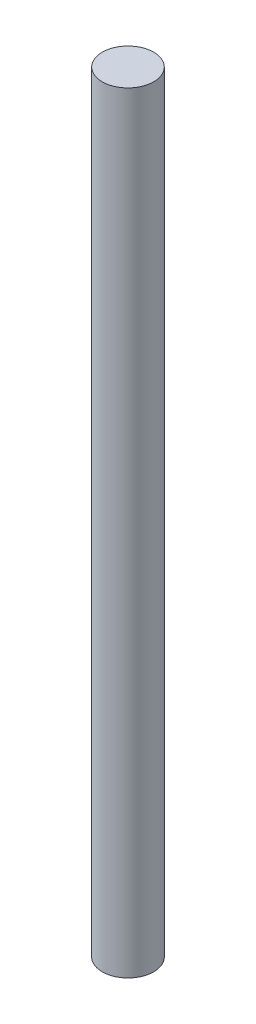
ISO-10303-21;
HEADER;
FILE_DESCRIPTION(('STEP AP214'),'2;1');
FILE_NAME('part.step','',(''),(''),'','','');
FILE_SCHEMA(('AUTOMOTIVE_DESIGN { 1 0 10303 214 1 1 1 1 }'));
ENDSEC;
DATA;
#1=APPLICATION_CONTEXT('core data for automotive mechanical design processes');
#2=APPLICATION_PROTOCOL_DEFINITION('international standard','automotive_design',2000,#1);
#3=PRODUCT_CONTEXT('',#1,'mechanical');
#4=PRODUCT('Part','Part','',(#3));
#5=PRODUCT_RELATED_PRODUCT_CATEGORY('part','',(#4));
#6=PRODUCT_DEFINITION_FORMATION('','',#4);
#7=PRODUCT_DEFINITION_CONTEXT('part definition',#1,'design');
#8=PRODUCT_DEFINITION('design','',#6,#7);
#9=PRODUCT_DEFINITION_SHAPE('','',#8);
#10=(LENGTH_UNIT() NAMED_UNIT(*) SI_UNIT(.MILLI.,.METRE.));
#11=(NAMED_UNIT(*) PLANE_ANGLE_UNIT() SI_UNIT($,.RADIAN.));
#12=(NAMED_UNIT(*) SI_UNIT($,.STERADIAN.) SOLID_ANGLE_UNIT());
#13=UNCERTAINTY_MEASURE_WITH_UNIT(LENGTH_MEASURE(1.E-05),#10,'distance_accuracy_value','');
#14=(GEOMETRIC_REPRESENTATION_CONTEXT(3) GLOBAL_UNCERTAINTY_ASSIGNED_CONTEXT((#13)) GLOBAL_UNIT_ASSIGNED_CONTEXT((#10,
#11,#12)) REPRESENTATION_CONTEXT('',''));
#15=CARTESIAN_POINT('',(0.,0.,0.));
#16=DIRECTION('',(0.,0.,1.));
#17=DIRECTION('',(1.,0.,0.));
#18=AXIS2_PLACEMENT_3D('',#15,#16,#17);
#19=CARTESIAN_POINT('',(0.,-300.,0.));
#20=DIRECTION('',(0.,1.,0.));
#21=DIRECTION('',(0.,0.,1.));
#22=AXIS2_PLACEMENT_3D('',#19,#20,#21);
#23=CYLINDRICAL_SURFACE('',#22,10.);
#24=CARTESIAN_POINT('',(2.,-22.3791395107628,-9.79795897113271));
#25=CARTESIAN_POINT('',(1.99999589175054,-22.4902682617451,-9.79796118053292));
#26=CARTESIAN_POINT('',(1.99070634343629,-22.6014487574295,-9.79987016537404));
#27=CARTESIAN_POINT('',(1.95382456716568,-22.8206645210491,-9.80728862609749));
#28=CARTESIAN_POINT('',(1.92621769414099,-22.9286972000348,-9.81280098289574));
#29=CARTESIAN_POINT('',(1.85359156523949,-23.1384141174712,-9.82677747443709));
#30=CARTESIAN_POINT('',(1.80858962830524,-23.240104553828,-9.83523867242151));
#31=CARTESIAN_POINT('',(1.70249821534101,-23.4344892001567,-9.85415598961317));
#32=CARTESIAN_POINT('',(1.6414096372023,-23.5271839118386,-9.86461199746922));
#33=CARTESIAN_POINT('',(1.50395815130687,-23.7022615184705,-9.88650599388505));
#34=CARTESIAN_POINT('',(1.42741131182664,-23.7844986865307,-9.89795475674493));
#35=CARTESIAN_POINT('',(1.26161357804262,-23.9350545779208,-9.92044944605197));
#36=CARTESIAN_POINT('',(1.17236179395597,-24.0033723255972,-9.93149534421663));
#37=CARTESIAN_POINT('',(0.982722711848511,-24.1247155460197,-9.95205592835124));
#38=CARTESIAN_POINT('',(0.882245135344419,-24.1776025383961,-9.96155642883101));
#39=CARTESIAN_POINT('',(0.673608300774541,-24.2656893848591,-9.97783473767263));
#40=CARTESIAN_POINT('',(0.565449762841105,-24.3008908945648,-9.98461280088238));
#41=CARTESIAN_POINT('',(0.346033546556988,-24.3521538980021,-9.99460641376837));
#42=CARTESIAN_POINT('',(0.234835478429628,-24.3684614659048,-9.99786772576254));
#43=CARTESIAN_POINT('',(0.0112371368750721,-24.3822414144394,-10.0006184236721));
#44=CARTESIAN_POINT('',(-0.101163019663687,-24.3797156100544,-10.0001081730552));
#45=CARTESIAN_POINT('',(-0.322284001487178,-24.3560871503317,-9.99540869737031));
#46=CARTESIAN_POINT('',(-0.431034428596941,-24.3352495564271,-9.99127196731677));
#47=CARTESIAN_POINT('',(-0.643463253160603,-24.276009445845,-9.97984354318817));
#48=CARTESIAN_POINT('',(-0.747141447494259,-24.2376062263791,-9.97255172288078));
#49=CARTESIAN_POINT('',(-0.947238926401775,-24.1440794304683,-9.95554592039917));
#50=CARTESIAN_POINT('',(-1.0436083482678,-24.088852008553,-9.94581696350447));
#51=CARTESIAN_POINT('',(-1.22581009171951,-23.9633213562896,-9.92500938947571));
#52=CARTESIAN_POINT('',(-1.31164119905,-23.8930163912218,-9.91393061710444));
#53=CARTESIAN_POINT('',(-1.47190286210692,-23.7378722665459,-9.89141928728919));
#54=CARTESIAN_POINT('',(-1.54610863314726,-23.6528011373036,-9.87998392915032));
#55=CARTESIAN_POINT('',(-1.67923698635362,-23.4713066258613,-9.85823143197521));
#56=CARTESIAN_POINT('',(-1.7381592794555,-23.3748830289964,-9.84791431409096));
#57=CARTESIAN_POINT('',(-1.83912562960376,-23.1730978471192,-9.82956094945847));
#58=CARTESIAN_POINT('',(-1.88113329555542,-23.0677175754835,-9.82152963127098));
#59=CARTESIAN_POINT('',(-1.94678068325516,-22.8511968633148,-9.80872952642545));
#60=CARTESIAN_POINT('',(-1.97042279891328,-22.7400571755246,-9.80396031456855));
#61=CARTESIAN_POINT('',(-1.9983320120721,-22.5172097947647,-9.79830958535655));
#62=CARTESIAN_POINT('',(-2.00292371779582,-22.4055443621421,-9.79736294114308));
#63=CARTESIAN_POINT('',(-1.99347525662148,-22.1830430643634,-9.79928971377708));
#64=CARTESIAN_POINT('',(-1.97943614624489,-22.0722071525251,-9.80216291400776));
#65=CARTESIAN_POINT('',(-1.93340441614831,-21.8556022301783,-9.81134464989829));
#66=CARTESIAN_POINT('',(-1.9015852416786,-21.7497948246913,-9.81761998028993));
#67=CARTESIAN_POINT('',(-1.82108207061704,-21.5450129527053,-9.83286978703329));
#68=CARTESIAN_POINT('',(-1.77239668474635,-21.4460390498914,-9.84184448572539));
#69=CARTESIAN_POINT('',(-1.6588082844312,-21.2563132908625,-9.86162811924079));
#70=CARTESIAN_POINT('',(-1.59370215596551,-21.1656854181611,-9.87245943729806));
#71=CARTESIAN_POINT('',(-1.44939114442542,-20.996522886761,-9.89467447653273));
#72=CARTESIAN_POINT('',(-1.37018481028907,-20.9179894742643,-9.90605825447636));
#73=CARTESIAN_POINT('',(-1.19846454699578,-20.7740143923916,-9.92830691738431));
#74=CARTESIAN_POINT('',(-1.10576499785926,-20.7087922014628,-9.93916115417367));
#75=CARTESIAN_POINT('',(-0.910535793269509,-20.5948477477636,-9.9589425525724));
#76=CARTESIAN_POINT('',(-0.808006550867012,-20.5461247920732,-9.96786979510422));
#77=CARTESIAN_POINT('',(-0.596605361648025,-20.4668817672695,-9.98274588122133));
#78=CARTESIAN_POINT('',(-0.487773346956156,-20.4362584743103,-9.98871158285205));
#79=CARTESIAN_POINT('',(-0.266378909359822,-20.3937570154351,-9.99706471875323));
#80=CARTESIAN_POINT('',(-0.153816937422423,-20.3818765918114,-9.99945258399698));
#81=CARTESIAN_POINT('',(0.069745787807243,-20.377285548837,-10.0003708090823));
#82=CARTESIAN_POINT('',(0.180739624282989,-20.3842449498503,-9.99896757098659));
#83=CARTESIAN_POINT('',(0.399942062631301,-20.4164074118585,-9.99260087120678));
#84=CARTESIAN_POINT('',(0.508150699507446,-20.4416102434591,-9.98763745428862));
#85=CARTESIAN_POINT('',(0.718505499490131,-20.509397494946,-9.97470996729841));
#86=CARTESIAN_POINT('',(0.82066488648033,-20.5519422670248,-9.9667527449523));
#87=CARTESIAN_POINT('',(1.01644244037214,-20.653163993425,-9.9486944424736));
#88=CARTESIAN_POINT('',(1.11005993153569,-20.7118422225718,-9.93859319293976));
#89=CARTESIAN_POINT('',(1.28772778021183,-20.8447782848854,-9.91715198313481));
#90=CARTESIAN_POINT('',(1.37159943222969,-20.9192721835304,-9.90579466835802));
#91=CARTESIAN_POINT('',(1.52576523551701,-21.0812399909603,-9.8832244581573));
#92=CARTESIAN_POINT('',(1.59605616641783,-21.1687169697227,-9.87201159757438));
#93=CARTESIAN_POINT('',(1.72178443889997,-21.3552981441437,-9.85086685467863));
#94=CARTESIAN_POINT('',(1.77705362923618,-21.4545174330053,-9.84095007142452));
#95=CARTESIAN_POINT('',(1.87004809853245,-21.661005057283,-9.82370474252826));
#96=CARTESIAN_POINT('',(1.90778929194833,-21.7682659881372,-9.81637385049968));
#97=CARTESIAN_POINT('',(1.95733827971531,-21.9596644216486,-9.8065936227569));
#98=CARTESIAN_POINT('',(1.97330779704737,-22.0427103497907,-9.80337569829212));
#99=CARTESIAN_POINT('',(1.99464003591942,-22.2102074198651,-9.79905756918169));
#100=CARTESIAN_POINT('',(2.00000312312529,-22.2946585132517,-9.79795729152836));
#101=CARTESIAN_POINT('',(2.,-22.3791395107628,-9.79795897113271));
#102=B_SPLINE_CURVE_WITH_KNOTS('',3,(#24,#25,#26,#27,#28,#29,#30,#31,#32,#33,#34,#35,#36,#37,
#38,#39,#40,#41,#42,#43,#44,#45,#46,#47,#48,#49,#50,#51,#52,#53,#54,#55,#56,#57,#58,#59,#60,#61,
#62,#63,#64,#65,#66,#67,#68,#69,#70,#71,#72,#73,#74,#75,#76,#77,#78,#79,#80,#81,#82,#83,#84,#85,
#86,#87,#88,#89,#90,#91,#92,#93,#94,#95,#96,#97,#98,#99,#100,#101),.UNSPECIFIED.,.T.,.F.,(4,2,2,
2,2,2,2,2,2,2,2,2,2,2,2,2,2,2,2,2,2,2,2,2,2,2,2,2,2,2,2,2,2,2,2,2,2,2,4),(0.,0.333076927738858,
0.666420478568594,0.999432995881165,1.33242692971973,1.66964505096874,2.00688680070844,
2.34706800874901,2.6872173649312,3.02288497766161,3.35852024232497,3.68937579267075,
4.020244581475,4.35319848444607,4.68619071540132,5.02498693524967,5.36378956245441,
5.70331726345553,6.04280070032049,6.37647515609187,6.71013069056843,7.04058683566638,
7.37107020708797,7.70586119549042,8.04068665740418,8.38065203466902,8.7206031326021,
9.05859627157301,9.39654869383256,9.72862034829372,10.0606878273351,10.392000341509,
10.7233390426937,11.0600230405119,11.3967867777956,11.7371779715921,12.077259501804,
12.3304760727632,12.5836839137096),.UNSPECIFIED.);
#103=CARTESIAN_POINT('',(2.,-22.3791395107628,-9.79795897113271));
#104=VERTEX_POINT('',#103);
#105=EDGE_CURVE('E39',#104,#104,#102,.T.);
#106=ORIENTED_EDGE('',*,*,#105,.F.);
#107=EDGE_LOOP('',(#106));
#108=FACE_BOUND('',#107,.T.);
#109=CARTESIAN_POINT('',(0.,-300.,0.));
#110=DIRECTION('',(0.,1.,0.));
#111=DIRECTION('',(0.,0.,1.));
#112=AXIS2_PLACEMENT_3D('',#109,#110,#111);
#113=CIRCLE('',#112,10.);
#114=CARTESIAN_POINT('',(0.,-300.,10.));
#115=VERTEX_POINT('',#114);
#116=EDGE_CURVE('E10',#115,#115,#113,.T.);
#117=ORIENTED_EDGE('',*,*,#116,.T.);
#118=EDGE_LOOP('',(#117));
#119=FACE_BOUND('',#118,.T.);
#120=CARTESIAN_POINT('',(0.,0.,0.));
#121=DIRECTION('',(0.,1.,0.));
#122=DIRECTION('',(0.,0.,1.));
#123=AXIS2_PLACEMENT_3D('',#120,#121,#122);
#124=CIRCLE('',#123,10.);
#125=CARTESIAN_POINT('',(0.,0.,10.));
#126=VERTEX_POINT('',#125);
#127=EDGE_CURVE('E47',#126,#126,#124,.T.);
#128=ORIENTED_EDGE('',*,*,#127,.F.);
#129=EDGE_LOOP('',(#128));
#130=FACE_BOUND('',#129,.T.);
#131=ADVANCED_FACE('F35',(#108,#119,#130),#23,.T.);
#132=CARTESIAN_POINT('',(0.,-300.,0.));
#133=DIRECTION('',(0.,1.,0.));
#134=DIRECTION('',(0.,0.,1.));
#135=AXIS2_PLACEMENT_3D('',#132,#133,#134);
#136=PLANE('',#135);
#137=ORIENTED_EDGE('',*,*,#116,.F.);
#138=EDGE_LOOP('',(#137));
#139=FACE_BOUND('',#138,.T.);
#140=ADVANCED_FACE('F63',(#139),#136,.F.);
#141=CARTESIAN_POINT('',(0.,0.,0.));
#142=DIRECTION('',(0.,1.,0.));
#143=DIRECTION('',(0.,0.,1.));
#144=AXIS2_PLACEMENT_3D('',#141,#142,#143);
#145=PLANE('',#144);
#146=ORIENTED_EDGE('',*,*,#127,.T.);
#147=EDGE_LOOP('',(#146));
#148=FACE_BOUND('',#147,.T.);
#149=ADVANCED_FACE('F67',(#148),#145,.T.);
#150=CARTESIAN_POINT('',(0.,-22.3791395107628,-300.));
#151=DIRECTION('',(0.,0.,1.));
#152=DIRECTION('',(1.,0.,0.));
#153=AXIS2_PLACEMENT_3D('',#150,#151,#152);
#154=CYLINDRICAL_SURFACE('',#153,2.);
#155=ORIENTED_EDGE('',*,*,#105,.T.);
#156=EDGE_LOOP('',(#155));
#157=FACE_BOUND('',#156,.T.);
#158=CARTESIAN_POINT('',(0.,-22.3791395107628,0.));
#159=DIRECTION('',(0.,0.,1.));
#160=DIRECTION('',(1.,0.,0.));
#161=AXIS2_PLACEMENT_3D('',#158,#159,#160);
#162=CIRCLE('',#161,2.);
#163=CARTESIAN_POINT('',(2.,-22.3791395107628,0.));
#164=VERTEX_POINT('',#163);
#165=EDGE_CURVE('E53',#164,#164,#162,.T.);
#166=ORIENTED_EDGE('',*,*,#165,.T.);
#167=EDGE_LOOP('',(#166));
#168=FACE_BOUND('',#167,.T.);
#169=ADVANCED_FACE('F60',(#157,#168),#154,.F.);
#170=CARTESIAN_POINT('',(0.,-22.3791395107628,0.));
#171=DIRECTION('',(0.,0.,1.));
#172=DIRECTION('',(1.,0.,0.));
#173=AXIS2_PLACEMENT_3D('',#170,#171,#172);
#174=PLANE('',#173);
#175=ORIENTED_EDGE('',*,*,#165,.F.);
#176=EDGE_LOOP('',(#175));
#177=FACE_BOUND('',#176,.T.);
#178=ADVANCED_FACE('F73',(#177),#174,.F.);
#179=CLOSED_SHELL('',(#131,#140,#149,#169,#178));
#180=MANIFOLD_SOLID_BREP('B2',#179);
#181=ADVANCED_BREP_SHAPE_REPRESENTATION('',(#18,#180),#14);
#182=SHAPE_DEFINITION_REPRESENTATION(#9,#181);
ENDSEC;
END-ISO-10303-21;
